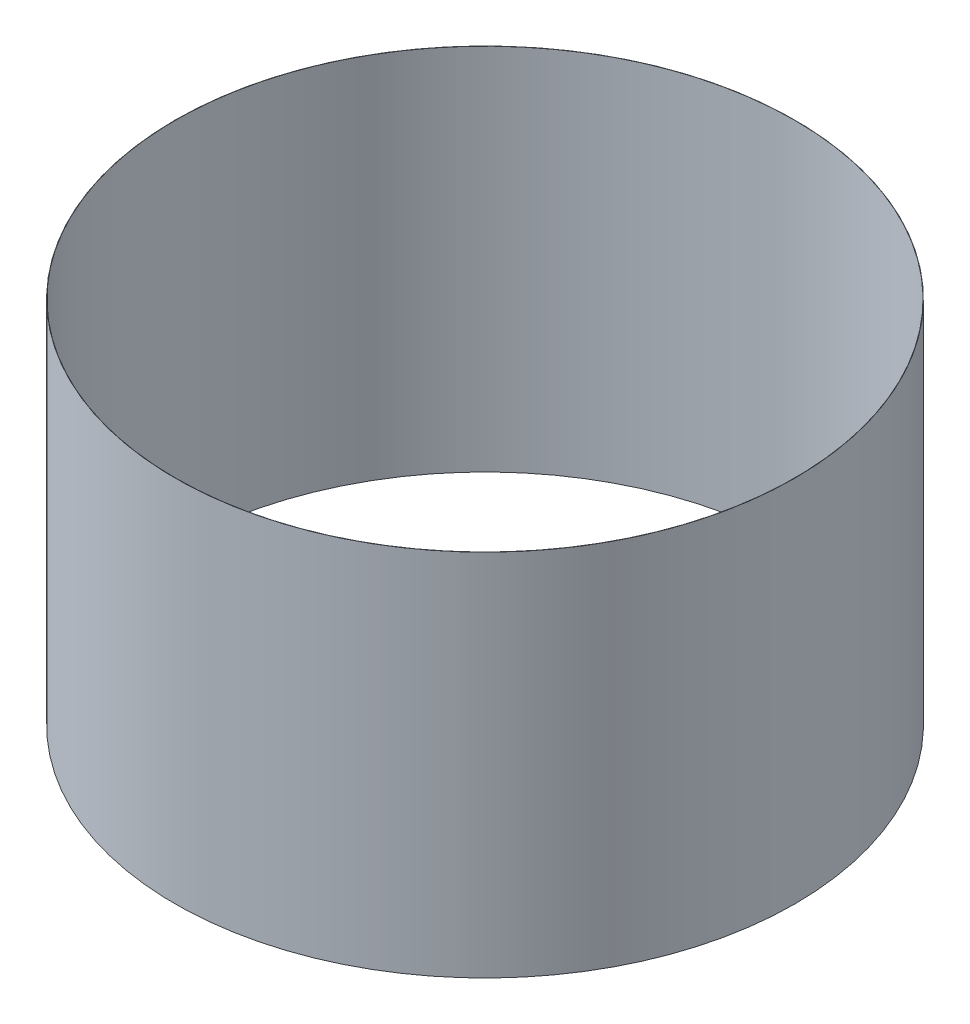
ISO-10303-21;
HEADER;
FILE_DESCRIPTION(('STEP AP214'),'2;1');
FILE_NAME('part.step','',(''),(''),'','','');
FILE_SCHEMA(('AUTOMOTIVE_DESIGN { 1 0 10303 214 1 1 1 1 }'));
ENDSEC;
DATA;
#1=APPLICATION_CONTEXT('core data for automotive mechanical design processes');
#2=APPLICATION_PROTOCOL_DEFINITION('international standard','automotive_design',2000,#1);
#3=PRODUCT_CONTEXT('',#1,'mechanical');
#4=PRODUCT('Part','Part','',(#3));
#5=PRODUCT_RELATED_PRODUCT_CATEGORY('part','',(#4));
#6=PRODUCT_DEFINITION_FORMATION('','',#4);
#7=PRODUCT_DEFINITION_CONTEXT('part definition',#1,'design');
#8=PRODUCT_DEFINITION('design','',#6,#7);
#9=PRODUCT_DEFINITION_SHAPE('','',#8);
#10=(LENGTH_UNIT() NAMED_UNIT(*) SI_UNIT(.MILLI.,.METRE.));
#11=(NAMED_UNIT(*) PLANE_ANGLE_UNIT() SI_UNIT($,.RADIAN.));
#12=(NAMED_UNIT(*) SI_UNIT($,.STERADIAN.) SOLID_ANGLE_UNIT());
#13=UNCERTAINTY_MEASURE_WITH_UNIT(LENGTH_MEASURE(1.E-05),#10,'distance_accuracy_value','');
#14=(GEOMETRIC_REPRESENTATION_CONTEXT(3) GLOBAL_UNCERTAINTY_ASSIGNED_CONTEXT((#13)) GLOBAL_UNIT_ASSIGNED_CONTEXT((#10,
#11,#12)) REPRESENTATION_CONTEXT('',''));
#15=CARTESIAN_POINT('',(0.,0.,0.));
#16=DIRECTION('',(0.,0.,1.));
#17=DIRECTION('',(1.,0.,0.));
#18=AXIS2_PLACEMENT_3D('',#15,#16,#17);
#19=CARTESIAN_POINT('',(0.,150.,0.));
#20=DIRECTION('',(0.,1.,0.));
#21=DIRECTION('',(0.,0.,1.));
#22=AXIS2_PLACEMENT_3D('',#19,#20,#21);
#23=PLANE('',#22);
#24=CARTESIAN_POINT('',(0.,150.,0.));
#25=DIRECTION('',(0.,1.,0.));
#26=DIRECTION('',(1.,0.,0.));
#27=AXIS2_PLACEMENT_3D('',#24,#25,#26);
#28=CIRCLE('',#27,126.1);
#29=CARTESIAN_POINT('',(126.1,150.,0.));
#30=VERTEX_POINT('',#29);
#31=EDGE_CURVE('E11',#30,#30,#28,.T.);
#32=ORIENTED_EDGE('',*,*,#31,.T.);
#33=EDGE_LOOP('',(#32));
#34=FACE_BOUND('',#33,.T.);
#35=CARTESIAN_POINT('',(0.,150.,0.));
#36=DIRECTION('',(0.,1.,0.));
#37=DIRECTION('',(0.,0.,1.));
#38=AXIS2_PLACEMENT_3D('',#35,#36,#37);
#39=CIRCLE('',#38,126.);
#40=CARTESIAN_POINT('',(0.,150.,126.));
#41=VERTEX_POINT('',#40);
#42=EDGE_CURVE('E48',#41,#41,#39,.T.);
#43=ORIENTED_EDGE('',*,*,#42,.F.);
#44=EDGE_LOOP('',(#43));
#45=FACE_BOUND('',#44,.T.);
#46=ADVANCED_FACE('F37',(#34,#45),#23,.T.);
#47=CARTESIAN_POINT('',(0.,0.,0.));
#48=DIRECTION('',(0.,1.,0.));
#49=DIRECTION('',(0.,0.,1.));
#50=AXIS2_PLACEMENT_3D('',#47,#48,#49);
#51=PLANE('',#50);
#52=CARTESIAN_POINT('',(0.,0.,0.));
#53=DIRECTION('',(0.,1.,0.));
#54=DIRECTION('',(1.,0.,0.));
#55=AXIS2_PLACEMENT_3D('',#52,#53,#54);
#56=CIRCLE('',#55,126.1);
#57=CARTESIAN_POINT('',(126.1,0.,0.));
#58=VERTEX_POINT('',#57);
#59=EDGE_CURVE('E41',#58,#58,#56,.T.);
#60=ORIENTED_EDGE('',*,*,#59,.F.);
#61=EDGE_LOOP('',(#60));
#62=FACE_BOUND('',#61,.T.);
#63=CARTESIAN_POINT('',(0.,0.,0.));
#64=DIRECTION('',(0.,1.,0.));
#65=DIRECTION('',(0.,0.,1.));
#66=AXIS2_PLACEMENT_3D('',#63,#64,#65);
#67=CIRCLE('',#66,126.);
#68=CARTESIAN_POINT('',(0.,0.,126.));
#69=VERTEX_POINT('',#68);
#70=EDGE_CURVE('E50',#69,#69,#67,.T.);
#71=ORIENTED_EDGE('',*,*,#70,.T.);
#72=EDGE_LOOP('',(#71));
#73=FACE_BOUND('',#72,.T.);
#74=ADVANCED_FACE('F60',(#62,#73),#51,.F.);
#75=CARTESIAN_POINT('',(0.,150.,0.));
#76=DIRECTION('',(0.,-1.,0.));
#77=DIRECTION('',(0.,0.,-1.));
#78=AXIS2_PLACEMENT_3D('',#75,#76,#77);
#79=CYLINDRICAL_SURFACE('',#78,126.1);
#80=ORIENTED_EDGE('',*,*,#31,.F.);
#81=EDGE_LOOP('',(#80));
#82=FACE_BOUND('',#81,.T.);
#83=ORIENTED_EDGE('',*,*,#59,.T.);
#84=EDGE_LOOP('',(#83));
#85=FACE_BOUND('',#84,.T.);
#86=ADVANCED_FACE('F39',(#82,#85),#79,.T.);
#87=CARTESIAN_POINT('',(0.,150.,0.));
#88=DIRECTION('',(0.,-1.,0.));
#89=DIRECTION('',(0.,0.,-1.));
#90=AXIS2_PLACEMENT_3D('',#87,#88,#89);
#91=CYLINDRICAL_SURFACE('',#90,126.);
#92=ORIENTED_EDGE('',*,*,#42,.T.);
#93=EDGE_LOOP('',(#92));
#94=FACE_BOUND('',#93,.T.);
#95=ORIENTED_EDGE('',*,*,#70,.F.);
#96=EDGE_LOOP('',(#95));
#97=FACE_BOUND('',#96,.T.);
#98=ADVANCED_FACE('F56',(#94,#97),#91,.F.);
#99=CLOSED_SHELL('',(#46,#74,#86,#98));
#100=MANIFOLD_SOLID_BREP('B2',#99);
#101=ADVANCED_BREP_SHAPE_REPRESENTATION('',(#18,#100),#14);
#102=SHAPE_DEFINITION_REPRESENTATION(#9,#101);
ENDSEC;
END-ISO-10303-21;
